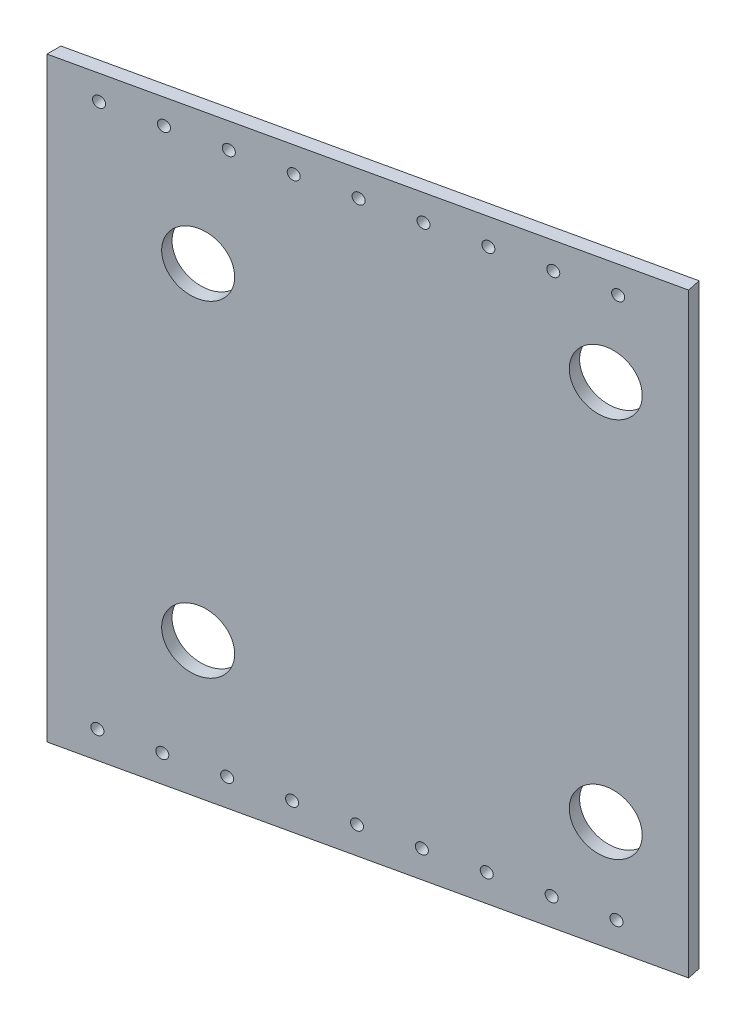
ISO-10303-21;
HEADER;
FILE_DESCRIPTION(('STEP AP214'),'2;1');
FILE_NAME('part.step','',(''),(''),'','','');
FILE_SCHEMA(('AUTOMOTIVE_DESIGN { 1 0 10303 214 1 1 1 1 }'));
ENDSEC;
DATA;
#1=APPLICATION_CONTEXT('core data for automotive mechanical design processes');
#2=APPLICATION_PROTOCOL_DEFINITION('international standard','automotive_design',2000,#1);
#3=PRODUCT_CONTEXT('',#1,'mechanical');
#4=PRODUCT('Part','Part','',(#3));
#5=PRODUCT_RELATED_PRODUCT_CATEGORY('part','',(#4));
#6=PRODUCT_DEFINITION_FORMATION('','',#4);
#7=PRODUCT_DEFINITION_CONTEXT('part definition',#1,'design');
#8=PRODUCT_DEFINITION('design','',#6,#7);
#9=PRODUCT_DEFINITION_SHAPE('','',#8);
#10=(LENGTH_UNIT() NAMED_UNIT(*) SI_UNIT(.MILLI.,.METRE.));
#11=(NAMED_UNIT(*) PLANE_ANGLE_UNIT() SI_UNIT($,.RADIAN.));
#12=(NAMED_UNIT(*) SI_UNIT($,.STERADIAN.) SOLID_ANGLE_UNIT());
#13=UNCERTAINTY_MEASURE_WITH_UNIT(LENGTH_MEASURE(1.E-05),#10,'distance_accuracy_value','');
#14=(GEOMETRIC_REPRESENTATION_CONTEXT(3) GLOBAL_UNCERTAINTY_ASSIGNED_CONTEXT((#13)) GLOBAL_UNIT_ASSIGNED_CONTEXT((#10,
#11,#12)) REPRESENTATION_CONTEXT('',''));
#15=CARTESIAN_POINT('',(0.,0.,0.));
#16=DIRECTION('',(0.,0.,1.));
#17=DIRECTION('',(1.,0.,0.));
#18=AXIS2_PLACEMENT_3D('',#15,#16,#17);
#19=CARTESIAN_POINT('',(472.462608451493,6.35,793.845234641783));
#20=DIRECTION('',(0.,-1.,0.));
#21=DIRECTION('',(0.,0.,-1.));
#22=AXIS2_PLACEMENT_3D('',#19,#20,#21);
#23=PLANE('',#22);
#24=DIRECTION('',(0.976296007119933,0.,-0.216439613938103));
#25=VECTOR('',#24,1.);
#26=CARTESIAN_POINT('',(473.837,6.35,800.044714286995));
#27=LINE('',#26,#25);
#28=CARTESIAN_POINT('',(473.837,6.35,800.044714286995));
#29=VERTEX_POINT('',#28);
#30=CARTESIAN_POINT('',(719.074,6.35,745.676980304428));
#31=VERTEX_POINT('',#30);
#32=EDGE_CURVE('E117',#29,#31,#27,.T.);
#33=ORIENTED_EDGE('',*,*,#32,.F.);
#34=DIRECTION('',(0.,0.,1.));
#35=VECTOR('',#34,1.);
#36=CARTESIAN_POINT('',(473.837,6.35000000000002,800.044714286995));
#37=LINE('',#36,#35);
#38=CARTESIAN_POINT('',(473.837,6.35,793.540539371097));
#39=VERTEX_POINT('',#38);
#40=EDGE_CURVE('E11',#39,#29,#37,.T.);
#41=ORIENTED_EDGE('',*,*,#40,.F.);
#42=DIRECTION('',(0.976296007119933,0.,-0.216439613938103));
#43=VECTOR('',#42,1.);
#44=CARTESIAN_POINT('',(472.462608451493,6.35,793.845234641783));
#45=LINE('',#44,#43);
#46=CARTESIAN_POINT('',(717.699608451493,6.35,739.477500659216));
#47=VERTEX_POINT('',#46);
#48=EDGE_CURVE('E98',#39,#47,#45,.T.);
#49=ORIENTED_EDGE('',*,*,#48,.T.);
#50=DIRECTION('',(0.216439613938103,0.,0.976296007119933));
#51=VECTOR('',#50,1.);
#52=CARTESIAN_POINT('',(717.699608451493,6.35,739.477500659216));
#53=LINE('',#52,#51);
#54=EDGE_CURVE('E83',#47,#31,#53,.T.);
#55=ORIENTED_EDGE('',*,*,#54,.T.);
#56=EDGE_LOOP('',(#33,#41,#49,#55));
#57=FACE_BOUND('',#56,.T.);
#58=ADVANCED_FACE('F45',(#57),#23,.T.);
#59=CARTESIAN_POINT('',(473.837,284.48,800.044714286995));
#60=DIRECTION('',(-1.,0.,0.));
#61=DIRECTION('',(0.,0.,1.));
#62=AXIS2_PLACEMENT_3D('',#59,#60,#61);
#63=PLANE('',#62);
#64=DIRECTION('',(0.,-1.,0.));
#65=VECTOR('',#64,1.);
#66=CARTESIAN_POINT('',(473.837,284.48,800.044714286995));
#67=LINE('',#66,#65);
#68=CARTESIAN_POINT('',(473.837,284.48,800.044714286995));
#69=VERTEX_POINT('',#68);
#70=EDGE_CURVE('E105',#69,#29,#67,.T.);
#71=ORIENTED_EDGE('',*,*,#70,.F.);
#72=DIRECTION('',(0.,0.,1.));
#73=VECTOR('',#72,1.);
#74=CARTESIAN_POINT('',(473.837,284.48,739.477500659217));
#75=LINE('',#74,#73);
#76=CARTESIAN_POINT('',(473.837,284.48,793.540539371097));
#77=VERTEX_POINT('',#76);
#78=EDGE_CURVE('E49',#77,#69,#75,.T.);
#79=ORIENTED_EDGE('',*,*,#78,.F.);
#80=DIRECTION('',(0.,-1.,0.));
#81=VECTOR('',#80,1.);
#82=CARTESIAN_POINT('',(473.837,0.,793.540539371098));
#83=LINE('',#82,#81);
#84=EDGE_CURVE('E92',#77,#39,#83,.T.);
#85=ORIENTED_EDGE('',*,*,#84,.T.);
#86=ORIENTED_EDGE('',*,*,#40,.T.);
#87=EDGE_LOOP('',(#71,#79,#85,#86));
#88=FACE_BOUND('',#87,.T.);
#89=ADVANCED_FACE('F47',(#88),#63,.T.);
#90=CARTESIAN_POINT('',(717.699608451493,284.48,739.477500659216));
#91=DIRECTION('',(0.,1.,0.));
#92=DIRECTION('',(0.,0.,1.));
#93=AXIS2_PLACEMENT_3D('',#90,#91,#92);
#94=PLANE('',#93);
#95=DIRECTION('',(-0.976296007119933,0.,0.216439613938103));
#96=VECTOR('',#95,1.);
#97=CARTESIAN_POINT('',(719.074,284.48,745.676980304428));
#98=LINE('',#97,#96);
#99=CARTESIAN_POINT('',(719.074,284.48,745.676980304428));
#100=VERTEX_POINT('',#99);
#101=EDGE_CURVE('E109',#100,#69,#98,.T.);
#102=ORIENTED_EDGE('',*,*,#101,.F.);
#103=DIRECTION('',(0.216439613938103,0.,0.976296007119933));
#104=VECTOR('',#103,1.);
#105=CARTESIAN_POINT('',(717.699608451493,284.48,739.477500659216));
#106=LINE('',#105,#104);
#107=CARTESIAN_POINT('',(717.699608451493,284.48,739.477500659216));
#108=VERTEX_POINT('',#107);
#109=EDGE_CURVE('E91',#108,#100,#106,.T.);
#110=ORIENTED_EDGE('',*,*,#109,.F.);
#111=DIRECTION('',(-0.976296007119933,0.,0.216439613938103));
#112=VECTOR('',#111,1.);
#113=CARTESIAN_POINT('',(717.699608451493,284.48,739.477500659216));
#114=LINE('',#113,#112);
#115=EDGE_CURVE('E101',#108,#77,#114,.T.);
#116=ORIENTED_EDGE('',*,*,#115,.T.);
#117=ORIENTED_EDGE('',*,*,#78,.T.);
#118=EDGE_LOOP('',(#102,#110,#116,#117));
#119=FACE_BOUND('',#118,.T.);
#120=ADVANCED_FACE('F132',(#119),#94,.T.);
#121=CARTESIAN_POINT('',(717.699608451493,6.35,739.477500659216));
#122=DIRECTION('',(0.976296007119933,0.,-0.216439613938103));
#123=DIRECTION('',(-0.216439613938103,0.,-0.976296007119933));
#124=AXIS2_PLACEMENT_3D('',#121,#122,#123);
#125=PLANE('',#124);
#126=DIRECTION('',(0.,1.,0.));
#127=VECTOR('',#126,1.);
#128=CARTESIAN_POINT('',(719.074,6.35,745.676980304428));
#129=LINE('',#128,#127);
#130=EDGE_CURVE('E88',#31,#100,#129,.T.);
#131=ORIENTED_EDGE('',*,*,#130,.F.);
#132=ORIENTED_EDGE('',*,*,#54,.F.);
#133=DIRECTION('',(0.,1.,0.));
#134=VECTOR('',#133,1.);
#135=CARTESIAN_POINT('',(717.699608451493,6.35,739.477500659216));
#136=LINE('',#135,#134);
#137=EDGE_CURVE('E86',#47,#108,#136,.T.);
#138=ORIENTED_EDGE('',*,*,#137,.T.);
#139=ORIENTED_EDGE('',*,*,#109,.T.);
#140=EDGE_LOOP('',(#131,#132,#138,#139));
#141=FACE_BOUND('',#140,.T.);
#142=ADVANCED_FACE('F85',(#141),#125,.T.);
#143=CARTESIAN_POINT('',(189.879780241853,0.,856.492339410407));
#144=DIRECTION('',(0.216439613938103,0.,0.976296007119933));
#145=DIRECTION('',(0.976296007119933,0.,-0.216439613938103));
#146=AXIS2_PLACEMENT_3D('',#143,#144,#145);
#147=PLANE('',#146);
#148=CARTESIAN_POINT('',(541.955358537632,272.691741314654,778.439062855306));
#149=DIRECTION('',(0.216439613938103,0.,0.976296007119933));
#150=DIRECTION('',(0.976296007119933,0.,-0.216439613938103));
#151=AXIS2_PLACEMENT_3D('',#148,#149,#150);
#152=CIRCLE('',#151,2.55270000000035);
#153=CARTESIAN_POINT('',(544.447549355007,272.691741314654,777.886557452807));
#154=VERTEX_POINT('',#153);
#155=EDGE_CURVE('E399',#154,#154,#152,.T.);
#156=ORIENTED_EDGE('',*,*,#155,.T.);
#157=EDGE_LOOP('',(#156));
#158=FACE_BOUND('',#157,.T.);
#159=CARTESIAN_POINT('',(591.550561813656,272.43490278426,767.44407099632));
#160=DIRECTION('',(0.216439613938103,0.,0.976296007119933));
#161=DIRECTION('',(0.976296007119933,0.,-0.216439613938103));
#162=AXIS2_PLACEMENT_3D('',#159,#160,#161);
#163=CIRCLE('',#162,2.55270000000035);
#164=CARTESIAN_POINT('',(594.042752631031,272.43490278426,766.89156559382));
#165=VERTEX_POINT('',#164);
#166=EDGE_CURVE('E406',#165,#165,#163,.T.);
#167=ORIENTED_EDGE('',*,*,#166,.T.);
#168=EDGE_LOOP('',(#167));
#169=FACE_BOUND('',#168,.T.);
#170=CARTESIAN_POINT('',(641.14576508968,272.178064253868,756.449079137334));
#171=DIRECTION('',(0.216439613938103,0.,0.976296007119933));
#172=DIRECTION('',(0.976296007119933,0.,-0.216439613938103));
#173=AXIS2_PLACEMENT_3D('',#170,#171,#172);
#174=CIRCLE('',#173,2.55270000000035);
#175=CARTESIAN_POINT('',(643.637955907055,272.178064253868,755.896573734834));
#176=VERTEX_POINT('',#175);
#177=EDGE_CURVE('E417',#176,#176,#174,.T.);
#178=ORIENTED_EDGE('',*,*,#177,.T.);
#179=EDGE_LOOP('',(#178));
#180=FACE_BOUND('',#179,.T.);
#181=CARTESIAN_POINT('',(690.740968365704,271.921225723475,745.454087278348));
#182=DIRECTION('',(0.216439613938103,0.,0.976296007119933));
#183=DIRECTION('',(0.976296007119933,0.,-0.216439613938103));
#184=AXIS2_PLACEMENT_3D('',#181,#182,#183);
#185=CIRCLE('',#184,2.55270000000035);
#186=CARTESIAN_POINT('',(693.233159183079,271.921225723475,744.901581875848));
#187=VERTEX_POINT('',#186);
#188=EDGE_CURVE('E425',#187,#187,#185,.T.);
#189=ORIENTED_EDGE('',*,*,#188,.T.);
#190=EDGE_LOOP('',(#189));
#191=FACE_BOUND('',#190,.T.);
#192=CARTESIAN_POINT('',(665.943366727692,272.049644988671,750.951583207841));
#193=DIRECTION('',(0.216439613938103,0.,0.976296007119933));
#194=DIRECTION('',(0.976296007119933,0.,-0.216439613938103));
#195=AXIS2_PLACEMENT_3D('',#192,#193,#194);
#196=CIRCLE('',#195,2.55270000000035);
#197=CARTESIAN_POINT('',(668.435557545067,272.049644988671,750.399077805341));
#198=VERTEX_POINT('',#197);
#199=EDGE_CURVE('E433',#198,#198,#196,.T.);
#200=ORIENTED_EDGE('',*,*,#199,.T.);
#201=EDGE_LOOP('',(#200));
#202=FACE_BOUND('',#201,.T.);
#203=CARTESIAN_POINT('',(616.348163451668,272.306483519064,761.946575066827));
#204=DIRECTION('',(0.216439613938103,0.,0.976296007119933));
#205=DIRECTION('',(0.976296007119933,0.,-0.216439613938103));
#206=AXIS2_PLACEMENT_3D('',#203,#204,#205);
#207=CIRCLE('',#206,2.55270000000035);
#208=CARTESIAN_POINT('',(618.840354269043,272.306483519064,761.394069664327));
#209=VERTEX_POINT('',#208);
#210=EDGE_CURVE('E441',#209,#209,#207,.T.);
#211=ORIENTED_EDGE('',*,*,#210,.T.);
#212=EDGE_LOOP('',(#211));
#213=FACE_BOUND('',#212,.T.);
#214=CARTESIAN_POINT('',(566.752960175644,272.563322049457,772.941566925813));
#215=DIRECTION('',(0.216439613938103,0.,0.976296007119933));
#216=DIRECTION('',(0.976296007119933,0.,-0.216439613938103));
#217=AXIS2_PLACEMENT_3D('',#214,#215,#216);
#218=CIRCLE('',#217,2.55270000000035);
#219=CARTESIAN_POINT('',(569.245150993019,272.563322049457,772.389061523314));
#220=VERTEX_POINT('',#219);
#221=EDGE_CURVE('E449',#220,#220,#218,.T.);
#222=ORIENTED_EDGE('',*,*,#221,.T.);
#223=EDGE_LOOP('',(#222));
#224=FACE_BOUND('',#223,.T.);
#225=CARTESIAN_POINT('',(517.15775689962,272.820160579849,783.9365587848));
#226=DIRECTION('',(0.216439613938103,0.,0.976296007119933));
#227=DIRECTION('',(0.976296007119933,0.,-0.216439613938103));
#228=AXIS2_PLACEMENT_3D('',#225,#226,#227);
#229=CIRCLE('',#228,2.55270000000035);
#230=CARTESIAN_POINT('',(519.649947716995,272.820160579849,783.3840533823));
#231=VERTEX_POINT('',#230);
#232=EDGE_CURVE('E457',#231,#231,#229,.T.);
#233=ORIENTED_EDGE('',*,*,#232,.T.);
#234=EDGE_LOOP('',(#233));
#235=FACE_BOUND('',#234,.T.);
#236=CARTESIAN_POINT('',(690.116874131222,19.05,745.592445639119));
#237=DIRECTION('',(0.216439613938103,0.,0.976296007119933));
#238=DIRECTION('',(0.976296007119933,0.,-0.216439613938103));
#239=AXIS2_PLACEMENT_3D('',#236,#237,#238);
#240=CIRCLE('',#239,2.55270000000033);
#241=CARTESIAN_POINT('',(692.609064948597,19.05,745.039940236619));
#242=VERTEX_POINT('',#241);
#243=EDGE_CURVE('E465',#242,#242,#240,.T.);
#244=ORIENTED_EDGE('',*,*,#243,.T.);
#245=EDGE_LOOP('',(#244));
#246=FACE_BOUND('',#245,.T.);
#247=CARTESIAN_POINT('',(665.318955550375,19.05,751.090011833147));
#248=DIRECTION('',(0.216439613938103,0.,0.976296007119933));
#249=DIRECTION('',(0.976296007119933,0.,-0.216439613938103));
#250=AXIS2_PLACEMENT_3D('',#247,#248,#249);
#251=CIRCLE('',#250,2.55270000000033);
#252=CARTESIAN_POINT('',(667.81114636775,19.05,750.537506430647));
#253=VERTEX_POINT('',#252);
#254=EDGE_CURVE('E473',#253,#253,#251,.T.);
#255=ORIENTED_EDGE('',*,*,#254,.T.);
#256=EDGE_LOOP('',(#255));
#257=FACE_BOUND('',#256,.T.);
#258=CARTESIAN_POINT('',(640.521036969529,19.05,756.587578027175));
#259=DIRECTION('',(0.216439613938103,0.,0.976296007119933));
#260=DIRECTION('',(0.976296007119933,0.,-0.216439613938103));
#261=AXIS2_PLACEMENT_3D('',#258,#259,#260);
#262=CIRCLE('',#261,2.55270000000033);
#263=CARTESIAN_POINT('',(643.013227786904,19.05,756.035072624675));
#264=VERTEX_POINT('',#263);
#265=EDGE_CURVE('E481',#264,#264,#262,.T.);
#266=ORIENTED_EDGE('',*,*,#265,.T.);
#267=EDGE_LOOP('',(#266));
#268=FACE_BOUND('',#267,.T.);
#269=CARTESIAN_POINT('',(615.723118388683,19.05,762.085144221202));
#270=DIRECTION('',(0.216439613938103,0.,0.976296007119933));
#271=DIRECTION('',(0.976296007119933,0.,-0.216439613938103));
#272=AXIS2_PLACEMENT_3D('',#269,#270,#271);
#273=CIRCLE('',#272,2.55270000000033);
#274=CARTESIAN_POINT('',(618.215309206058,19.05,761.532638818702));
#275=VERTEX_POINT('',#274);
#276=EDGE_CURVE('E489',#275,#275,#273,.T.);
#277=ORIENTED_EDGE('',*,*,#276,.T.);
#278=EDGE_LOOP('',(#277));
#279=FACE_BOUND('',#278,.T.);
#280=CARTESIAN_POINT('',(590.925199807837,19.05,767.58271041523));
#281=DIRECTION('',(0.216439613938103,0.,0.976296007119933));
#282=DIRECTION('',(0.976296007119933,0.,-0.216439613938103));
#283=AXIS2_PLACEMENT_3D('',#280,#281,#282);
#284=CIRCLE('',#283,2.55270000000033);
#285=CARTESIAN_POINT('',(593.417390625212,19.05,767.03020501273));
#286=VERTEX_POINT('',#285);
#287=EDGE_CURVE('E497',#286,#286,#284,.T.);
#288=ORIENTED_EDGE('',*,*,#287,.T.);
#289=EDGE_LOOP('',(#288));
#290=FACE_BOUND('',#289,.T.);
#291=CARTESIAN_POINT('',(566.12728122699,19.05,773.080276609258));
#292=DIRECTION('',(0.216439613938103,0.,0.976296007119933));
#293=DIRECTION('',(0.976296007119933,0.,-0.216439613938103));
#294=AXIS2_PLACEMENT_3D('',#291,#292,#293);
#295=CIRCLE('',#294,2.55270000000033);
#296=CARTESIAN_POINT('',(568.619472044365,19.05,772.527771206758));
#297=VERTEX_POINT('',#296);
#298=EDGE_CURVE('E505',#297,#297,#295,.T.);
#299=ORIENTED_EDGE('',*,*,#298,.T.);
#300=EDGE_LOOP('',(#299));
#301=FACE_BOUND('',#300,.T.);
#302=CARTESIAN_POINT('',(541.329362646144,19.05,778.577842803286));
#303=DIRECTION('',(0.216439613938103,0.,0.976296007119933));
#304=DIRECTION('',(0.976296007119933,0.,-0.216439613938103));
#305=AXIS2_PLACEMENT_3D('',#302,#303,#304);
#306=CIRCLE('',#305,2.55270000000033);
#307=CARTESIAN_POINT('',(543.821553463519,19.05,778.025337400786));
#308=VERTEX_POINT('',#307);
#309=EDGE_CURVE('E513',#308,#308,#306,.T.);
#310=ORIENTED_EDGE('',*,*,#309,.T.);
#311=EDGE_LOOP('',(#310));
#312=FACE_BOUND('',#311,.T.);
#313=CARTESIAN_POINT('',(516.531444065298,19.05,784.075408997314));
#314=DIRECTION('',(0.216439613938103,0.,0.976296007119933));
#315=DIRECTION('',(0.976296007119933,0.,-0.216439613938103));
#316=AXIS2_PLACEMENT_3D('',#313,#314,#315);
#317=CIRCLE('',#316,2.55270000000033);
#318=CARTESIAN_POINT('',(519.023634882673,19.05,783.522903594814));
#319=VERTEX_POINT('',#318);
#320=EDGE_CURVE('E521',#319,#319,#317,.T.);
#321=ORIENTED_EDGE('',*,*,#320,.T.);
#322=EDGE_LOOP('',(#321));
#323=FACE_BOUND('',#322,.T.);
#324=CARTESIAN_POINT('',(491.733525484452,19.05,789.572975191341));
#325=DIRECTION('',(0.216439613938103,0.,0.976296007119933));
#326=DIRECTION('',(0.976296007119933,0.,-0.216439613938103));
#327=AXIS2_PLACEMENT_3D('',#324,#325,#326);
#328=CIRCLE('',#327,2.55270000000033);
#329=CARTESIAN_POINT('',(494.225716301827,19.05,789.020469788841));
#330=VERTEX_POINT('',#329);
#331=EDGE_CURVE('E529',#330,#330,#328,.T.);
#332=ORIENTED_EDGE('',*,*,#331,.T.);
#333=EDGE_LOOP('',(#332));
#334=FACE_BOUND('',#333,.T.);
#335=CARTESIAN_POINT('',(492.360155261608,272.948579845046,789.434054714293));
#336=DIRECTION('',(0.216439613938103,0.,0.976296007119933));
#337=DIRECTION('',(0.976296007119933,0.,-0.216439613938103));
#338=AXIS2_PLACEMENT_3D('',#335,#336,#337);
#339=CIRCLE('',#338,2.55270000000035);
#340=CARTESIAN_POINT('',(494.852346078983,272.948579845046,788.881549311793));
#341=VERTEX_POINT('',#340);
#342=EDGE_CURVE('E537',#341,#341,#339,.T.);
#343=ORIENTED_EDGE('',*,*,#342,.T.);
#344=EDGE_LOOP('',(#343));
#345=FACE_BOUND('',#344,.T.);
#346=CARTESIAN_POINT('',(530.24592419651,222.25,781.034981951301));
#347=DIRECTION('',(0.216439613938103,0.,0.976296007119933));
#348=DIRECTION('',(0.976296007119933,0.,-0.216439613938103));
#349=AXIS2_PLACEMENT_3D('',#346,#347,#348);
#350=CIRCLE('',#349,14.2874999999991);
#351=CARTESIAN_POINT('',(544.194753398235,222.25,777.942600967161));
#352=VERTEX_POINT('',#351);
#353=EDGE_CURVE('E545',#352,#352,#350,.T.);
#354=ORIENTED_EDGE('',*,*,#353,.T.);
#355=EDGE_LOOP('',(#354));
#356=FACE_BOUND('',#355,.T.);
#357=CARTESIAN_POINT('',(686.000296774254,234.95,746.505068867515));
#358=DIRECTION('',(0.216439613938103,0.,0.976296007119933));
#359=DIRECTION('',(0.976296007119933,0.,-0.216439613938103));
#360=AXIS2_PLACEMENT_3D('',#357,#358,#359);
#361=CIRCLE('',#360,14.2874999999991);
#362=CARTESIAN_POINT('',(699.94912597598,234.95,743.412687883375));
#363=VERTEX_POINT('',#362);
#364=EDGE_CURVE('E553',#363,#363,#361,.T.);
#365=ORIENTED_EDGE('',*,*,#364,.T.);
#366=EDGE_LOOP('',(#365));
#367=FACE_BOUND('',#366,.T.);
#368=CARTESIAN_POINT('',(686.000296774254,57.15,746.505068867515));
#369=DIRECTION('',(0.216439613938103,0.,0.976296007119933));
#370=DIRECTION('',(0.976296007119933,0.,-0.216439613938103));
#371=AXIS2_PLACEMENT_3D('',#368,#369,#370);
#372=CIRCLE('',#371,14.2874999999991);
#373=CARTESIAN_POINT('',(699.94912597598,57.15,743.412687883375));
#374=VERTEX_POINT('',#373);
#375=EDGE_CURVE('E561',#374,#374,#372,.T.);
#376=ORIENTED_EDGE('',*,*,#375,.T.);
#377=EDGE_LOOP('',(#376));
#378=FACE_BOUND('',#377,.T.);
#379=CARTESIAN_POINT('',(530.24592419651,69.85,781.034981951301));
#380=DIRECTION('',(0.216439613938103,0.,0.976296007119933));
#381=DIRECTION('',(0.976296007119933,0.,-0.216439613938103));
#382=AXIS2_PLACEMENT_3D('',#379,#380,#381);
#383=CIRCLE('',#382,14.2874999999991);
#384=CARTESIAN_POINT('',(544.194753398235,69.85,777.942600967161));
#385=VERTEX_POINT('',#384);
#386=EDGE_CURVE('E112',#385,#385,#383,.T.);
#387=ORIENTED_EDGE('',*,*,#386,.T.);
#388=EDGE_LOOP('',(#387));
#389=FACE_BOUND('',#388,.T.);
#390=ORIENTED_EDGE('',*,*,#48,.F.);
#391=ORIENTED_EDGE('',*,*,#84,.F.);
#392=ORIENTED_EDGE('',*,*,#115,.F.);
#393=ORIENTED_EDGE('',*,*,#137,.F.);
#394=EDGE_LOOP('',(#390,#391,#392,#393));
#395=FACE_BOUND('',#394,.T.);
#396=ADVANCED_FACE('F96',(#158,#169,#180,#191,#202,#213,#224,#235,#246,#257,#268,#279,#290,#301,
#312,#323,#334,#345,#356,#367,#378,#389,#395),#147,.F.);
#397=CARTESIAN_POINT('',(191.25417179036,0.,862.691819055619));
#398=DIRECTION('',(0.216439613938103,0.,0.976296007119933));
#399=DIRECTION('',(0.976296007119933,0.,-0.216439613938103));
#400=AXIS2_PLACEMENT_3D('',#397,#398,#399);
#401=PLANE('',#400);
#402=CARTESIAN_POINT('',(543.329750086139,272.691741314654,784.638542500518));
#403=DIRECTION('',(0.216439613938103,0.,0.976296007119933));
#404=DIRECTION('',(0.976296007119933,0.,-0.216439613938103));
#405=AXIS2_PLACEMENT_3D('',#402,#403,#404);
#406=CIRCLE('',#405,2.55270000000035);
#407=CARTESIAN_POINT('',(545.821940903514,272.691741314654,784.086037098018));
#408=VERTEX_POINT('',#407);
#409=EDGE_CURVE('E396',#408,#408,#406,.T.);
#410=ORIENTED_EDGE('',*,*,#409,.F.);
#411=EDGE_LOOP('',(#410));
#412=FACE_BOUND('',#411,.T.);
#413=CARTESIAN_POINT('',(592.924953362163,272.43490278426,773.643550641532));
#414=DIRECTION('',(0.216439613938103,0.,0.976296007119933));
#415=DIRECTION('',(0.976296007119933,0.,-0.216439613938103));
#416=AXIS2_PLACEMENT_3D('',#413,#414,#415);
#417=CIRCLE('',#416,2.55270000000035);
#418=CARTESIAN_POINT('',(595.417144179538,272.43490278426,773.091045239032));
#419=VERTEX_POINT('',#418);
#420=EDGE_CURVE('E401',#419,#419,#417,.T.);
#421=ORIENTED_EDGE('',*,*,#420,.F.);
#422=EDGE_LOOP('',(#421));
#423=FACE_BOUND('',#422,.T.);
#424=CARTESIAN_POINT('',(642.520156638187,272.178064253868,762.648558782546));
#425=DIRECTION('',(0.216439613938103,0.,0.976296007119933));
#426=DIRECTION('',(0.976296007119933,0.,-0.216439613938103));
#427=AXIS2_PLACEMENT_3D('',#424,#425,#426);
#428=CIRCLE('',#427,2.55270000000035);
#429=CARTESIAN_POINT('',(645.012347455562,272.178064253868,762.096053380046));
#430=VERTEX_POINT('',#429);
#431=EDGE_CURVE('E413',#430,#430,#428,.T.);
#432=ORIENTED_EDGE('',*,*,#431,.F.);
#433=EDGE_LOOP('',(#432));
#434=FACE_BOUND('',#433,.T.);
#435=CARTESIAN_POINT('',(692.115359914211,271.921225723475,751.65356692356));
#436=DIRECTION('',(0.216439613938103,0.,0.976296007119933));
#437=DIRECTION('',(0.976296007119933,0.,-0.216439613938103));
#438=AXIS2_PLACEMENT_3D('',#435,#436,#437);
#439=CIRCLE('',#438,2.55270000000035);
#440=CARTESIAN_POINT('',(694.607550731586,271.921225723475,751.10106152106));
#441=VERTEX_POINT('',#440);
#442=EDGE_CURVE('E421',#441,#441,#439,.T.);
#443=ORIENTED_EDGE('',*,*,#442,.F.);
#444=EDGE_LOOP('',(#443));
#445=FACE_BOUND('',#444,.T.);
#446=CARTESIAN_POINT('',(667.317758276199,272.049644988671,757.151062853053));
#447=DIRECTION('',(0.216439613938103,0.,0.976296007119933));
#448=DIRECTION('',(0.976296007119933,0.,-0.216439613938103));
#449=AXIS2_PLACEMENT_3D('',#446,#447,#448);
#450=CIRCLE('',#449,2.55270000000035);
#451=CARTESIAN_POINT('',(669.809949093574,272.049644988671,756.598557450553));
#452=VERTEX_POINT('',#451);
#453=EDGE_CURVE('E429',#452,#452,#450,.T.);
#454=ORIENTED_EDGE('',*,*,#453,.F.);
#455=EDGE_LOOP('',(#454));
#456=FACE_BOUND('',#455,.T.);
#457=CARTESIAN_POINT('',(617.722555000175,272.306483519064,768.146054712039));
#458=DIRECTION('',(0.216439613938103,0.,0.976296007119933));
#459=DIRECTION('',(0.976296007119933,0.,-0.216439613938103));
#460=AXIS2_PLACEMENT_3D('',#457,#458,#459);
#461=CIRCLE('',#460,2.55270000000035);
#462=CARTESIAN_POINT('',(620.21474581755,272.306483519064,767.593549309539));
#463=VERTEX_POINT('',#462);
#464=EDGE_CURVE('E437',#463,#463,#461,.T.);
#465=ORIENTED_EDGE('',*,*,#464,.F.);
#466=EDGE_LOOP('',(#465));
#467=FACE_BOUND('',#466,.T.);
#468=CARTESIAN_POINT('',(568.127351724151,272.563322049457,779.141046571025));
#469=DIRECTION('',(0.216439613938103,0.,0.976296007119933));
#470=DIRECTION('',(0.976296007119933,0.,-0.216439613938103));
#471=AXIS2_PLACEMENT_3D('',#468,#469,#470);
#472=CIRCLE('',#471,2.55270000000035);
#473=CARTESIAN_POINT('',(570.619542541526,272.563322049457,778.588541168525));
#474=VERTEX_POINT('',#473);
#475=EDGE_CURVE('E445',#474,#474,#472,.T.);
#476=ORIENTED_EDGE('',*,*,#475,.F.);
#477=EDGE_LOOP('',(#476));
#478=FACE_BOUND('',#477,.T.);
#479=CARTESIAN_POINT('',(518.532148448127,272.820160579849,790.136038430011));
#480=DIRECTION('',(0.216439613938103,0.,0.976296007119933));
#481=DIRECTION('',(0.976296007119933,0.,-0.216439613938103));
#482=AXIS2_PLACEMENT_3D('',#479,#480,#481);
#483=CIRCLE('',#482,2.55270000000035);
#484=CARTESIAN_POINT('',(521.024339265502,272.820160579849,789.583533027512));
#485=VERTEX_POINT('',#484);
#486=EDGE_CURVE('E453',#485,#485,#483,.T.);
#487=ORIENTED_EDGE('',*,*,#486,.F.);
#488=EDGE_LOOP('',(#487));
#489=FACE_BOUND('',#488,.T.);
#490=CARTESIAN_POINT('',(691.491265679729,19.05,751.791925284331));
#491=DIRECTION('',(0.216439613938103,0.,0.976296007119933));
#492=DIRECTION('',(0.976296007119933,0.,-0.216439613938103));
#493=AXIS2_PLACEMENT_3D('',#490,#491,#492);
#494=CIRCLE('',#493,2.55270000000033);
#495=CARTESIAN_POINT('',(693.983456497104,19.05,751.239419881831));
#496=VERTEX_POINT('',#495);
#497=EDGE_CURVE('E461',#496,#496,#494,.T.);
#498=ORIENTED_EDGE('',*,*,#497,.F.);
#499=EDGE_LOOP('',(#498));
#500=FACE_BOUND('',#499,.T.);
#501=CARTESIAN_POINT('',(666.693347098882,19.05,757.289491478359));
#502=DIRECTION('',(0.216439613938103,0.,0.976296007119933));
#503=DIRECTION('',(0.976296007119933,0.,-0.216439613938103));
#504=AXIS2_PLACEMENT_3D('',#501,#502,#503);
#505=CIRCLE('',#504,2.55270000000033);
#506=CARTESIAN_POINT('',(669.185537916257,19.05,756.736986075859));
#507=VERTEX_POINT('',#506);
#508=EDGE_CURVE('E469',#507,#507,#505,.T.);
#509=ORIENTED_EDGE('',*,*,#508,.F.);
#510=EDGE_LOOP('',(#509));
#511=FACE_BOUND('',#510,.T.);
#512=CARTESIAN_POINT('',(641.895428518036,19.05,762.787057672386));
#513=DIRECTION('',(0.216439613938103,0.,0.976296007119933));
#514=DIRECTION('',(0.976296007119933,0.,-0.216439613938103));
#515=AXIS2_PLACEMENT_3D('',#512,#513,#514);
#516=CIRCLE('',#515,2.55270000000033);
#517=CARTESIAN_POINT('',(644.387619335411,19.05,762.234552269886));
#518=VERTEX_POINT('',#517);
#519=EDGE_CURVE('E477',#518,#518,#516,.T.);
#520=ORIENTED_EDGE('',*,*,#519,.F.);
#521=EDGE_LOOP('',(#520));
#522=FACE_BOUND('',#521,.T.);
#523=CARTESIAN_POINT('',(617.09750993719,19.05,768.284623866414));
#524=DIRECTION('',(0.216439613938103,0.,0.976296007119933));
#525=DIRECTION('',(0.976296007119933,0.,-0.216439613938103));
#526=AXIS2_PLACEMENT_3D('',#523,#524,#525);
#527=CIRCLE('',#526,2.55270000000033);
#528=CARTESIAN_POINT('',(619.589700754565,19.05,767.732118463914));
#529=VERTEX_POINT('',#528);
#530=EDGE_CURVE('E485',#529,#529,#527,.T.);
#531=ORIENTED_EDGE('',*,*,#530,.F.);
#532=EDGE_LOOP('',(#531));
#533=FACE_BOUND('',#532,.T.);
#534=CARTESIAN_POINT('',(592.299591356344,19.05,773.782190060442));
#535=DIRECTION('',(0.216439613938103,0.,0.976296007119933));
#536=DIRECTION('',(0.976296007119933,0.,-0.216439613938103));
#537=AXIS2_PLACEMENT_3D('',#534,#535,#536);
#538=CIRCLE('',#537,2.55270000000033);
#539=CARTESIAN_POINT('',(594.791782173719,19.05,773.229684657942));
#540=VERTEX_POINT('',#539);
#541=EDGE_CURVE('E493',#540,#540,#538,.T.);
#542=ORIENTED_EDGE('',*,*,#541,.F.);
#543=EDGE_LOOP('',(#542));
#544=FACE_BOUND('',#543,.T.);
#545=CARTESIAN_POINT('',(567.501672775497,19.05,779.27975625447));
#546=DIRECTION('',(0.216439613938103,0.,0.976296007119933));
#547=DIRECTION('',(0.976296007119933,0.,-0.216439613938103));
#548=AXIS2_PLACEMENT_3D('',#545,#546,#547);
#549=CIRCLE('',#548,2.55270000000033);
#550=CARTESIAN_POINT('',(569.993863592872,19.05,778.72725085197));
#551=VERTEX_POINT('',#550);
#552=EDGE_CURVE('E501',#551,#551,#549,.T.);
#553=ORIENTED_EDGE('',*,*,#552,.F.);
#554=EDGE_LOOP('',(#553));
#555=FACE_BOUND('',#554,.T.);
#556=CARTESIAN_POINT('',(542.703754194651,19.05,784.777322448498));
#557=DIRECTION('',(0.216439613938103,0.,0.976296007119933));
#558=DIRECTION('',(0.976296007119933,0.,-0.216439613938103));
#559=AXIS2_PLACEMENT_3D('',#556,#557,#558);
#560=CIRCLE('',#559,2.55270000000033);
#561=CARTESIAN_POINT('',(545.195945012026,19.05,784.224817045998));
#562=VERTEX_POINT('',#561);
#563=EDGE_CURVE('E509',#562,#562,#560,.T.);
#564=ORIENTED_EDGE('',*,*,#563,.F.);
#565=EDGE_LOOP('',(#564));
#566=FACE_BOUND('',#565,.T.);
#567=CARTESIAN_POINT('',(517.905835613805,19.05,790.274888642525));
#568=DIRECTION('',(0.216439613938103,0.,0.976296007119933));
#569=DIRECTION('',(0.976296007119933,0.,-0.216439613938103));
#570=AXIS2_PLACEMENT_3D('',#567,#568,#569);
#571=CIRCLE('',#570,2.55270000000033);
#572=CARTESIAN_POINT('',(520.39802643118,19.05,789.722383240025));
#573=VERTEX_POINT('',#572);
#574=EDGE_CURVE('E517',#573,#573,#571,.T.);
#575=ORIENTED_EDGE('',*,*,#574,.F.);
#576=EDGE_LOOP('',(#575));
#577=FACE_BOUND('',#576,.T.);
#578=CARTESIAN_POINT('',(493.107917032959,19.05,795.772454836553));
#579=DIRECTION('',(0.216439613938103,0.,0.976296007119933));
#580=DIRECTION('',(0.976296007119933,0.,-0.216439613938103));
#581=AXIS2_PLACEMENT_3D('',#578,#579,#580);
#582=CIRCLE('',#581,2.55270000000033);
#583=CARTESIAN_POINT('',(495.600107850334,19.05,795.219949434053));
#584=VERTEX_POINT('',#583);
#585=EDGE_CURVE('E525',#584,#584,#582,.T.);
#586=ORIENTED_EDGE('',*,*,#585,.F.);
#587=EDGE_LOOP('',(#586));
#588=FACE_BOUND('',#587,.T.);
#589=CARTESIAN_POINT('',(493.734546810115,272.948579845046,795.633534359504));
#590=DIRECTION('',(0.216439613938103,0.,0.976296007119933));
#591=DIRECTION('',(0.976296007119933,0.,-0.216439613938103));
#592=AXIS2_PLACEMENT_3D('',#589,#590,#591);
#593=CIRCLE('',#592,2.55270000000035);
#594=CARTESIAN_POINT('',(496.22673762749,272.948579845046,795.081028957005));
#595=VERTEX_POINT('',#594);
#596=EDGE_CURVE('E533',#595,#595,#593,.T.);
#597=ORIENTED_EDGE('',*,*,#596,.F.);
#598=EDGE_LOOP('',(#597));
#599=FACE_BOUND('',#598,.T.);
#600=CARTESIAN_POINT('',(531.620315745017,222.25,787.234461596514));
#601=DIRECTION('',(0.2164396139381,0.,0.976296007119934));
#602=DIRECTION('',(0.976296007119934,0.,-0.2164396139381));
#603=AXIS2_PLACEMENT_3D('',#600,#601,#602);
#604=CIRCLE('',#603,14.2874999999991);
#605=CARTESIAN_POINT('',(545.569144946742,222.25,784.142080612374));
#606=VERTEX_POINT('',#605);
#607=EDGE_CURVE('E541',#606,#606,#604,.T.);
#608=ORIENTED_EDGE('',*,*,#607,.F.);
#609=EDGE_LOOP('',(#608));
#610=FACE_BOUND('',#609,.T.);
#611=CARTESIAN_POINT('',(687.374688322762,234.95,752.704548512729));
#612=DIRECTION('',(0.2164396139381,0.,0.976296007119934));
#613=DIRECTION('',(0.976296007119934,0.,-0.2164396139381));
#614=AXIS2_PLACEMENT_3D('',#611,#612,#613);
#615=CIRCLE('',#614,14.2874999999991);
#616=CARTESIAN_POINT('',(701.323517524487,234.95,749.612167528588));
#617=VERTEX_POINT('',#616);
#618=EDGE_CURVE('E549',#617,#617,#615,.T.);
#619=ORIENTED_EDGE('',*,*,#618,.F.);
#620=EDGE_LOOP('',(#619));
#621=FACE_BOUND('',#620,.T.);
#622=CARTESIAN_POINT('',(687.374688322762,57.15,752.704548512729));
#623=DIRECTION('',(0.2164396139381,0.,0.976296007119934));
#624=DIRECTION('',(0.976296007119934,0.,-0.2164396139381));
#625=AXIS2_PLACEMENT_3D('',#622,#623,#624);
#626=CIRCLE('',#625,14.2874999999991);
#627=CARTESIAN_POINT('',(701.323517524487,57.15,749.612167528588));
#628=VERTEX_POINT('',#627);
#629=EDGE_CURVE('E557',#628,#628,#626,.T.);
#630=ORIENTED_EDGE('',*,*,#629,.F.);
#631=EDGE_LOOP('',(#630));
#632=FACE_BOUND('',#631,.T.);
#633=CARTESIAN_POINT('',(531.620315745017,69.85,787.234461596514));
#634=DIRECTION('',(0.2164396139381,0.,0.976296007119934));
#635=DIRECTION('',(0.976296007119934,0.,-0.2164396139381));
#636=AXIS2_PLACEMENT_3D('',#633,#634,#635);
#637=CIRCLE('',#636,14.2874999999991);
#638=CARTESIAN_POINT('',(545.569144946742,69.85,784.142080612374));
#639=VERTEX_POINT('',#638);
#640=EDGE_CURVE('E564',#639,#639,#637,.T.);
#641=ORIENTED_EDGE('',*,*,#640,.F.);
#642=EDGE_LOOP('',(#641));
#643=FACE_BOUND('',#642,.T.);
#644=ORIENTED_EDGE('',*,*,#32,.T.);
#645=ORIENTED_EDGE('',*,*,#130,.T.);
#646=ORIENTED_EDGE('',*,*,#101,.T.);
#647=ORIENTED_EDGE('',*,*,#70,.T.);
#648=EDGE_LOOP('',(#644,#645,#646,#647));
#649=FACE_BOUND('',#648,.T.);
#650=ADVANCED_FACE('F134',(#412,#423,#434,#445,#456,#467,#478,#489,#500,#511,#522,#533,#544,
#555,#566,#577,#588,#599,#610,#621,#632,#643,#649),#401,.T.);
#651=CARTESIAN_POINT('',(531.620315745017,69.85,787.234461596514));
#652=DIRECTION('',(0.2164396139381,0.,0.976296007119934));
#653=DIRECTION('',(0.976296007119934,0.,-0.2164396139381));
#654=AXIS2_PLACEMENT_3D('',#651,#652,#653);
#655=CYLINDRICAL_SURFACE('',#654,14.2874999999991);
#656=ORIENTED_EDGE('',*,*,#640,.T.);
#657=EDGE_LOOP('',(#656));
#658=FACE_BOUND('',#657,.T.);
#659=ORIENTED_EDGE('',*,*,#386,.F.);
#660=EDGE_LOOP('',(#659));
#661=FACE_BOUND('',#660,.T.);
#662=ADVANCED_FACE('F136',(#658,#661),#655,.F.);
#663=CARTESIAN_POINT('',(687.374688322762,57.15,752.704548512729));
#664=DIRECTION('',(0.2164396139381,0.,0.976296007119934));
#665=DIRECTION('',(0.976296007119934,0.,-0.2164396139381));
#666=AXIS2_PLACEMENT_3D('',#663,#664,#665);
#667=CYLINDRICAL_SURFACE('',#666,14.2874999999991);
#668=ORIENTED_EDGE('',*,*,#629,.T.);
#669=EDGE_LOOP('',(#668));
#670=FACE_BOUND('',#669,.T.);
#671=ORIENTED_EDGE('',*,*,#375,.F.);
#672=EDGE_LOOP('',(#671));
#673=FACE_BOUND('',#672,.T.);
#674=ADVANCED_FACE('F144',(#670,#673),#667,.F.);
#675=CARTESIAN_POINT('',(687.374688322762,234.95,752.704548512729));
#676=DIRECTION('',(0.2164396139381,0.,0.976296007119934));
#677=DIRECTION('',(0.976296007119934,0.,-0.2164396139381));
#678=AXIS2_PLACEMENT_3D('',#675,#676,#677);
#679=CYLINDRICAL_SURFACE('',#678,14.2874999999991);
#680=ORIENTED_EDGE('',*,*,#618,.T.);
#681=EDGE_LOOP('',(#680));
#682=FACE_BOUND('',#681,.T.);
#683=ORIENTED_EDGE('',*,*,#364,.F.);
#684=EDGE_LOOP('',(#683));
#685=FACE_BOUND('',#684,.T.);
#686=ADVANCED_FACE('F176',(#682,#685),#679,.F.);
#687=CARTESIAN_POINT('',(531.620315745017,222.25,787.234461596514));
#688=DIRECTION('',(0.2164396139381,0.,0.976296007119934));
#689=DIRECTION('',(0.976296007119934,0.,-0.2164396139381));
#690=AXIS2_PLACEMENT_3D('',#687,#688,#689);
#691=CYLINDRICAL_SURFACE('',#690,14.2874999999991);
#692=ORIENTED_EDGE('',*,*,#607,.T.);
#693=EDGE_LOOP('',(#692));
#694=FACE_BOUND('',#693,.T.);
#695=ORIENTED_EDGE('',*,*,#353,.F.);
#696=EDGE_LOOP('',(#695));
#697=FACE_BOUND('',#696,.T.);
#698=ADVANCED_FACE('F185',(#694,#697),#691,.F.);
#699=CARTESIAN_POINT('',(493.734546810115,272.948579845046,795.633534359504));
#700=DIRECTION('',(0.216439613938103,0.,0.976296007119933));
#701=DIRECTION('',(0.976296007119933,0.,-0.216439613938103));
#702=AXIS2_PLACEMENT_3D('',#699,#700,#701);
#703=CYLINDRICAL_SURFACE('',#702,2.55270000000035);
#704=ORIENTED_EDGE('',*,*,#596,.T.);
#705=EDGE_LOOP('',(#704));
#706=FACE_BOUND('',#705,.T.);
#707=ORIENTED_EDGE('',*,*,#342,.F.);
#708=EDGE_LOOP('',(#707));
#709=FACE_BOUND('',#708,.T.);
#710=ADVANCED_FACE('F193',(#706,#709),#703,.F.);
#711=CARTESIAN_POINT('',(493.107917032959,19.05,795.772454836553));
#712=DIRECTION('',(0.216439613938103,0.,0.976296007119933));
#713=DIRECTION('',(0.976296007119933,0.,-0.216439613938103));
#714=AXIS2_PLACEMENT_3D('',#711,#712,#713);
#715=CYLINDRICAL_SURFACE('',#714,2.55270000000033);
#716=ORIENTED_EDGE('',*,*,#585,.T.);
#717=EDGE_LOOP('',(#716));
#718=FACE_BOUND('',#717,.T.);
#719=ORIENTED_EDGE('',*,*,#331,.F.);
#720=EDGE_LOOP('',(#719));
#721=FACE_BOUND('',#720,.T.);
#722=ADVANCED_FACE('F220',(#718,#721),#715,.F.);
#723=CARTESIAN_POINT('',(517.905835613805,19.05,790.274888642525));
#724=DIRECTION('',(0.216439613938103,0.,0.976296007119933));
#725=DIRECTION('',(0.976296007119933,0.,-0.216439613938103));
#726=AXIS2_PLACEMENT_3D('',#723,#724,#725);
#727=CYLINDRICAL_SURFACE('',#726,2.55270000000033);
#728=ORIENTED_EDGE('',*,*,#574,.T.);
#729=EDGE_LOOP('',(#728));
#730=FACE_BOUND('',#729,.T.);
#731=ORIENTED_EDGE('',*,*,#320,.F.);
#732=EDGE_LOOP('',(#731));
#733=FACE_BOUND('',#732,.T.);
#734=ADVANCED_FACE('F229',(#730,#733),#727,.F.);
#735=CARTESIAN_POINT('',(542.703754194651,19.05,784.777322448498));
#736=DIRECTION('',(0.216439613938103,0.,0.976296007119933));
#737=DIRECTION('',(0.976296007119933,0.,-0.216439613938103));
#738=AXIS2_PLACEMENT_3D('',#735,#736,#737);
#739=CYLINDRICAL_SURFACE('',#738,2.55270000000033);
#740=ORIENTED_EDGE('',*,*,#563,.T.);
#741=EDGE_LOOP('',(#740));
#742=FACE_BOUND('',#741,.T.);
#743=ORIENTED_EDGE('',*,*,#309,.F.);
#744=EDGE_LOOP('',(#743));
#745=FACE_BOUND('',#744,.T.);
#746=ADVANCED_FACE('F238',(#742,#745),#739,.F.);
#747=CARTESIAN_POINT('',(567.501672775497,19.05,779.27975625447));
#748=DIRECTION('',(0.216439613938103,0.,0.976296007119933));
#749=DIRECTION('',(0.976296007119933,0.,-0.216439613938103));
#750=AXIS2_PLACEMENT_3D('',#747,#748,#749);
#751=CYLINDRICAL_SURFACE('',#750,2.55270000000033);
#752=ORIENTED_EDGE('',*,*,#552,.T.);
#753=EDGE_LOOP('',(#752));
#754=FACE_BOUND('',#753,.T.);
#755=ORIENTED_EDGE('',*,*,#298,.F.);
#756=EDGE_LOOP('',(#755));
#757=FACE_BOUND('',#756,.T.);
#758=ADVANCED_FACE('F247',(#754,#757),#751,.F.);
#759=CARTESIAN_POINT('',(592.299591356344,19.05,773.782190060442));
#760=DIRECTION('',(0.216439613938103,0.,0.976296007119933));
#761=DIRECTION('',(0.976296007119933,0.,-0.216439613938103));
#762=AXIS2_PLACEMENT_3D('',#759,#760,#761);
#763=CYLINDRICAL_SURFACE('',#762,2.55270000000033);
#764=ORIENTED_EDGE('',*,*,#541,.T.);
#765=EDGE_LOOP('',(#764));
#766=FACE_BOUND('',#765,.T.);
#767=ORIENTED_EDGE('',*,*,#287,.F.);
#768=EDGE_LOOP('',(#767));
#769=FACE_BOUND('',#768,.T.);
#770=ADVANCED_FACE('F256',(#766,#769),#763,.F.);
#771=CARTESIAN_POINT('',(617.09750993719,19.05,768.284623866414));
#772=DIRECTION('',(0.216439613938103,0.,0.976296007119933));
#773=DIRECTION('',(0.976296007119933,0.,-0.216439613938103));
#774=AXIS2_PLACEMENT_3D('',#771,#772,#773);
#775=CYLINDRICAL_SURFACE('',#774,2.55270000000033);
#776=ORIENTED_EDGE('',*,*,#530,.T.);
#777=EDGE_LOOP('',(#776));
#778=FACE_BOUND('',#777,.T.);
#779=ORIENTED_EDGE('',*,*,#276,.F.);
#780=EDGE_LOOP('',(#779));
#781=FACE_BOUND('',#780,.T.);
#782=ADVANCED_FACE('F265',(#778,#781),#775,.F.);
#783=CARTESIAN_POINT('',(641.895428518036,19.05,762.787057672386));
#784=DIRECTION('',(0.216439613938103,0.,0.976296007119933));
#785=DIRECTION('',(0.976296007119933,0.,-0.216439613938103));
#786=AXIS2_PLACEMENT_3D('',#783,#784,#785);
#787=CYLINDRICAL_SURFACE('',#786,2.55270000000033);
#788=ORIENTED_EDGE('',*,*,#519,.T.);
#789=EDGE_LOOP('',(#788));
#790=FACE_BOUND('',#789,.T.);
#791=ORIENTED_EDGE('',*,*,#265,.F.);
#792=EDGE_LOOP('',(#791));
#793=FACE_BOUND('',#792,.T.);
#794=ADVANCED_FACE('F274',(#790,#793),#787,.F.);
#795=CARTESIAN_POINT('',(666.693347098882,19.05,757.289491478359));
#796=DIRECTION('',(0.216439613938103,0.,0.976296007119933));
#797=DIRECTION('',(0.976296007119933,0.,-0.216439613938103));
#798=AXIS2_PLACEMENT_3D('',#795,#796,#797);
#799=CYLINDRICAL_SURFACE('',#798,2.55270000000033);
#800=ORIENTED_EDGE('',*,*,#508,.T.);
#801=EDGE_LOOP('',(#800));
#802=FACE_BOUND('',#801,.T.);
#803=ORIENTED_EDGE('',*,*,#254,.F.);
#804=EDGE_LOOP('',(#803));
#805=FACE_BOUND('',#804,.T.);
#806=ADVANCED_FACE('F283',(#802,#805),#799,.F.);
#807=CARTESIAN_POINT('',(691.491265679729,19.05,751.791925284331));
#808=DIRECTION('',(0.216439613938103,0.,0.976296007119933));
#809=DIRECTION('',(0.976296007119933,0.,-0.216439613938103));
#810=AXIS2_PLACEMENT_3D('',#807,#808,#809);
#811=CYLINDRICAL_SURFACE('',#810,2.55270000000033);
#812=ORIENTED_EDGE('',*,*,#497,.T.);
#813=EDGE_LOOP('',(#812));
#814=FACE_BOUND('',#813,.T.);
#815=ORIENTED_EDGE('',*,*,#243,.F.);
#816=EDGE_LOOP('',(#815));
#817=FACE_BOUND('',#816,.T.);
#818=ADVANCED_FACE('F292',(#814,#817),#811,.F.);
#819=CARTESIAN_POINT('',(518.532148448127,272.820160579849,790.136038430011));
#820=DIRECTION('',(0.216439613938103,0.,0.976296007119933));
#821=DIRECTION('',(0.976296007119933,0.,-0.216439613938103));
#822=AXIS2_PLACEMENT_3D('',#819,#820,#821);
#823=CYLINDRICAL_SURFACE('',#822,2.55270000000035);
#824=ORIENTED_EDGE('',*,*,#486,.T.);
#825=EDGE_LOOP('',(#824));
#826=FACE_BOUND('',#825,.T.);
#827=ORIENTED_EDGE('',*,*,#232,.F.);
#828=EDGE_LOOP('',(#827));
#829=FACE_BOUND('',#828,.T.);
#830=ADVANCED_FACE('F301',(#826,#829),#823,.F.);
#831=CARTESIAN_POINT('',(568.127351724151,272.563322049457,779.141046571025));
#832=DIRECTION('',(0.216439613938103,0.,0.976296007119933));
#833=DIRECTION('',(0.976296007119933,0.,-0.216439613938103));
#834=AXIS2_PLACEMENT_3D('',#831,#832,#833);
#835=CYLINDRICAL_SURFACE('',#834,2.55270000000035);
#836=ORIENTED_EDGE('',*,*,#475,.T.);
#837=EDGE_LOOP('',(#836));
#838=FACE_BOUND('',#837,.T.);
#839=ORIENTED_EDGE('',*,*,#221,.F.);
#840=EDGE_LOOP('',(#839));
#841=FACE_BOUND('',#840,.T.);
#842=ADVANCED_FACE('F310',(#838,#841),#835,.F.);
#843=CARTESIAN_POINT('',(617.722555000175,272.306483519064,768.146054712039));
#844=DIRECTION('',(0.216439613938103,0.,0.976296007119933));
#845=DIRECTION('',(0.976296007119933,0.,-0.216439613938103));
#846=AXIS2_PLACEMENT_3D('',#843,#844,#845);
#847=CYLINDRICAL_SURFACE('',#846,2.55270000000035);
#848=ORIENTED_EDGE('',*,*,#464,.T.);
#849=EDGE_LOOP('',(#848));
#850=FACE_BOUND('',#849,.T.);
#851=ORIENTED_EDGE('',*,*,#210,.F.);
#852=EDGE_LOOP('',(#851));
#853=FACE_BOUND('',#852,.T.);
#854=ADVANCED_FACE('F319',(#850,#853),#847,.F.);
#855=CARTESIAN_POINT('',(667.317758276199,272.049644988671,757.151062853053));
#856=DIRECTION('',(0.216439613938103,0.,0.976296007119933));
#857=DIRECTION('',(0.976296007119933,0.,-0.216439613938103));
#858=AXIS2_PLACEMENT_3D('',#855,#856,#857);
#859=CYLINDRICAL_SURFACE('',#858,2.55270000000035);
#860=ORIENTED_EDGE('',*,*,#453,.T.);
#861=EDGE_LOOP('',(#860));
#862=FACE_BOUND('',#861,.T.);
#863=ORIENTED_EDGE('',*,*,#199,.F.);
#864=EDGE_LOOP('',(#863));
#865=FACE_BOUND('',#864,.T.);
#866=ADVANCED_FACE('F328',(#862,#865),#859,.F.);
#867=CARTESIAN_POINT('',(692.115359914211,271.921225723475,751.65356692356));
#868=DIRECTION('',(0.216439613938103,0.,0.976296007119933));
#869=DIRECTION('',(0.976296007119933,0.,-0.216439613938103));
#870=AXIS2_PLACEMENT_3D('',#867,#868,#869);
#871=CYLINDRICAL_SURFACE('',#870,2.55270000000035);
#872=ORIENTED_EDGE('',*,*,#442,.T.);
#873=EDGE_LOOP('',(#872));
#874=FACE_BOUND('',#873,.T.);
#875=ORIENTED_EDGE('',*,*,#188,.F.);
#876=EDGE_LOOP('',(#875));
#877=FACE_BOUND('',#876,.T.);
#878=ADVANCED_FACE('F337',(#874,#877),#871,.F.);
#879=CARTESIAN_POINT('',(642.520156638187,272.178064253868,762.648558782546));
#880=DIRECTION('',(0.216439613938103,0.,0.976296007119933));
#881=DIRECTION('',(0.976296007119933,0.,-0.216439613938103));
#882=AXIS2_PLACEMENT_3D('',#879,#880,#881);
#883=CYLINDRICAL_SURFACE('',#882,2.55270000000035);
#884=ORIENTED_EDGE('',*,*,#431,.T.);
#885=EDGE_LOOP('',(#884));
#886=FACE_BOUND('',#885,.T.);
#887=ORIENTED_EDGE('',*,*,#177,.F.);
#888=EDGE_LOOP('',(#887));
#889=FACE_BOUND('',#888,.T.);
#890=ADVANCED_FACE('F346',(#886,#889),#883,.F.);
#891=CARTESIAN_POINT('',(592.924953362163,272.43490278426,773.643550641532));
#892=DIRECTION('',(0.216439613938103,0.,0.976296007119933));
#893=DIRECTION('',(0.976296007119933,0.,-0.216439613938103));
#894=AXIS2_PLACEMENT_3D('',#891,#892,#893);
#895=CYLINDRICAL_SURFACE('',#894,2.55270000000035);
#896=ORIENTED_EDGE('',*,*,#420,.T.);
#897=EDGE_LOOP('',(#896));
#898=FACE_BOUND('',#897,.T.);
#899=ORIENTED_EDGE('',*,*,#166,.F.);
#900=EDGE_LOOP('',(#899));
#901=FACE_BOUND('',#900,.T.);
#902=ADVANCED_FACE('F355',(#898,#901),#895,.F.);
#903=CARTESIAN_POINT('',(543.329750086139,272.691741314654,784.638542500518));
#904=DIRECTION('',(0.216439613938103,0.,0.976296007119933));
#905=DIRECTION('',(0.976296007119933,0.,-0.216439613938103));
#906=AXIS2_PLACEMENT_3D('',#903,#904,#905);
#907=CYLINDRICAL_SURFACE('',#906,2.55270000000035);
#908=ORIENTED_EDGE('',*,*,#409,.T.);
#909=EDGE_LOOP('',(#908));
#910=FACE_BOUND('',#909,.T.);
#911=ORIENTED_EDGE('',*,*,#155,.F.);
#912=EDGE_LOOP('',(#911));
#913=FACE_BOUND('',#912,.T.);
#914=ADVANCED_FACE('F364',(#910,#913),#907,.F.);
#915=CLOSED_SHELL('',(#58,#89,#120,#142,#396,#650,#662,#674,#686,#698,#710,#722,#734,#746,#758,
#770,#782,#794,#806,#818,#830,#842,#854,#866,#878,#890,#902,#914));
#916=MANIFOLD_SOLID_BREP('B2',#915);
#917=ADVANCED_BREP_SHAPE_REPRESENTATION('',(#18,#916),#14);
#918=SHAPE_DEFINITION_REPRESENTATION(#9,#917);
ENDSEC;
END-ISO-10303-21;
